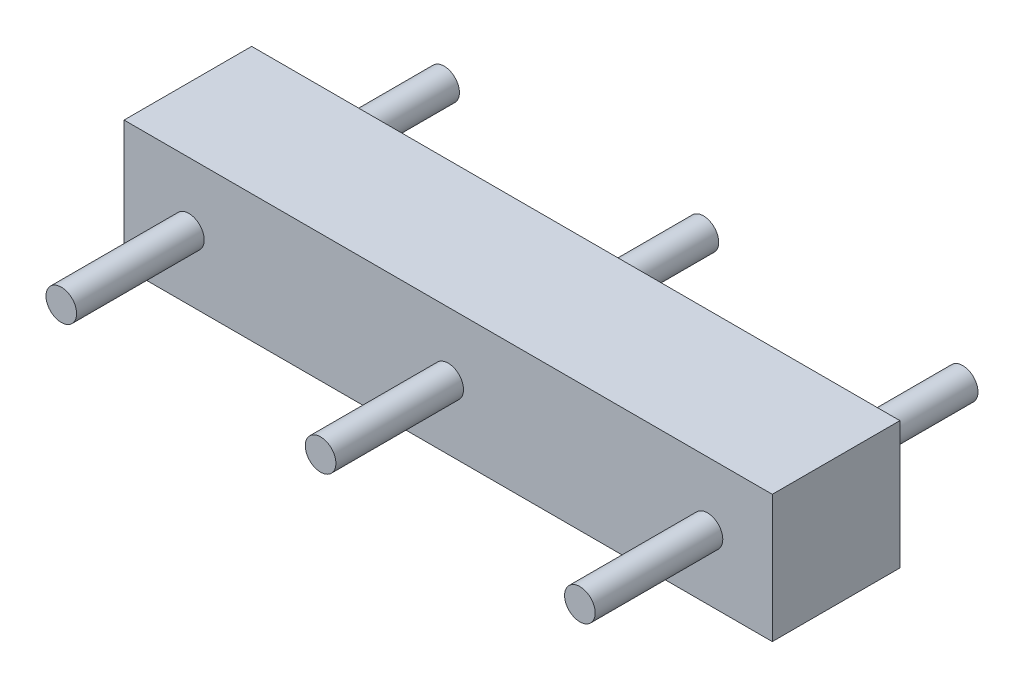
ISO-10303-21;
HEADER;
FILE_DESCRIPTION(('STEP AP214'),'2;1');
FILE_NAME('part.step','',(''),(''),'','','');
FILE_SCHEMA(('AUTOMOTIVE_DESIGN { 1 0 10303 214 1 1 1 1 }'));
ENDSEC;
DATA;
#1=APPLICATION_CONTEXT('core data for automotive mechanical design processes');
#2=APPLICATION_PROTOCOL_DEFINITION('international standard','automotive_design',2000,#1);
#3=PRODUCT_CONTEXT('',#1,'mechanical');
#4=PRODUCT('Part','Part','',(#3));
#5=PRODUCT_RELATED_PRODUCT_CATEGORY('part','',(#4));
#6=PRODUCT_DEFINITION_FORMATION('','',#4);
#7=PRODUCT_DEFINITION_CONTEXT('part definition',#1,'design');
#8=PRODUCT_DEFINITION('design','',#6,#7);
#9=PRODUCT_DEFINITION_SHAPE('','',#8);
#10=(LENGTH_UNIT() NAMED_UNIT(*) SI_UNIT(.MILLI.,.METRE.));
#11=(NAMED_UNIT(*) PLANE_ANGLE_UNIT() SI_UNIT($,.RADIAN.));
#12=(NAMED_UNIT(*) SI_UNIT($,.STERADIAN.) SOLID_ANGLE_UNIT());
#13=UNCERTAINTY_MEASURE_WITH_UNIT(LENGTH_MEASURE(1.E-05),#10,'distance_accuracy_value','');
#14=(GEOMETRIC_REPRESENTATION_CONTEXT(3) GLOBAL_UNCERTAINTY_ASSIGNED_CONTEXT((#13)) GLOBAL_UNIT_ASSIGNED_CONTEXT((#10,
#11,#12)) REPRESENTATION_CONTEXT('',''));
#15=CARTESIAN_POINT('',(0.,0.,0.));
#16=DIRECTION('',(0.,0.,1.));
#17=DIRECTION('',(1.,0.,0.));
#18=AXIS2_PLACEMENT_3D('',#15,#16,#17);
#19=CARTESIAN_POINT('',(0.,0.,2.5));
#20=DIRECTION('',(1.,0.,0.));
#21=DIRECTION('',(0.,0.,-1.));
#22=AXIS2_PLACEMENT_3D('',#19,#20,#21);
#23=PLANE('',#22);
#24=DIRECTION('',(0.,-1.,0.));
#25=VECTOR('',#24,1.);
#26=CARTESIAN_POINT('',(0.,0.,0.));
#27=LINE('',#26,#25);
#28=CARTESIAN_POINT('',(0.,2.5,0.));
#29=VERTEX_POINT('',#28);
#30=CARTESIAN_POINT('',(0.,0.,0.));
#31=VERTEX_POINT('',#30);
#32=EDGE_CURVE('E103',#29,#31,#27,.T.);
#33=ORIENTED_EDGE('',*,*,#32,.T.);
#34=DIRECTION('',(0.,0.,-1.));
#35=VECTOR('',#34,1.);
#36=CARTESIAN_POINT('',(0.,0.,2.5));
#37=LINE('',#36,#35);
#38=CARTESIAN_POINT('',(0.,0.,2.5));
#39=VERTEX_POINT('',#38);
#40=EDGE_CURVE('E94',#39,#31,#37,.T.);
#41=ORIENTED_EDGE('',*,*,#40,.F.);
#42=DIRECTION('',(0.,-1.,0.));
#43=VECTOR('',#42,1.);
#44=CARTESIAN_POINT('',(0.,0.,2.5));
#45=LINE('',#44,#43);
#46=CARTESIAN_POINT('',(0.,2.5,2.5));
#47=VERTEX_POINT('',#46);
#48=EDGE_CURVE('E88',#47,#39,#45,.T.);
#49=ORIENTED_EDGE('',*,*,#48,.F.);
#50=DIRECTION('',(0.,0.,-1.));
#51=VECTOR('',#50,1.);
#52=CARTESIAN_POINT('',(0.,2.5,2.5));
#53=LINE('',#52,#51);
#54=EDGE_CURVE('E99',#47,#29,#53,.T.);
#55=ORIENTED_EDGE('',*,*,#54,.T.);
#56=EDGE_LOOP('',(#33,#41,#49,#55));
#57=FACE_BOUND('',#56,.T.);
#58=ADVANCED_FACE('F36',(#57),#23,.F.);
#59=CARTESIAN_POINT('',(0.,0.,2.5));
#60=DIRECTION('',(0.,1.,0.));
#61=DIRECTION('',(0.,0.,1.));
#62=AXIS2_PLACEMENT_3D('',#59,#60,#61);
#63=PLANE('',#62);
#64=DIRECTION('',(1.,0.,0.));
#65=VECTOR('',#64,1.);
#66=CARTESIAN_POINT('',(0.,0.,0.));
#67=LINE('',#66,#65);
#68=CARTESIAN_POINT('',(12.7,0.,0.));
#69=VERTEX_POINT('',#68);
#70=EDGE_CURVE('E93',#31,#69,#67,.T.);
#71=ORIENTED_EDGE('',*,*,#70,.T.);
#72=DIRECTION('',(0.,0.,-1.));
#73=VECTOR('',#72,1.);
#74=CARTESIAN_POINT('',(12.7,0.,2.5));
#75=LINE('',#74,#73);
#76=CARTESIAN_POINT('',(12.7,0.,2.5));
#77=VERTEX_POINT('',#76);
#78=EDGE_CURVE('E91',#77,#69,#75,.T.);
#79=ORIENTED_EDGE('',*,*,#78,.F.);
#80=DIRECTION('',(1.,0.,0.));
#81=VECTOR('',#80,1.);
#82=CARTESIAN_POINT('',(0.,0.,2.5));
#83=LINE('',#82,#81);
#84=EDGE_CURVE('E83',#39,#77,#83,.T.);
#85=ORIENTED_EDGE('',*,*,#84,.F.);
#86=ORIENTED_EDGE('',*,*,#40,.T.);
#87=EDGE_LOOP('',(#71,#79,#85,#86));
#88=FACE_BOUND('',#87,.T.);
#89=ADVANCED_FACE('F92',(#88),#63,.F.);
#90=CARTESIAN_POINT('',(12.7,0.,2.5));
#91=DIRECTION('',(-1.,0.,0.));
#92=DIRECTION('',(0.,0.,1.));
#93=AXIS2_PLACEMENT_3D('',#90,#91,#92);
#94=PLANE('',#93);
#95=DIRECTION('',(0.,1.,0.));
#96=VECTOR('',#95,1.);
#97=CARTESIAN_POINT('',(12.7,0.,0.));
#98=LINE('',#97,#96);
#99=CARTESIAN_POINT('',(12.7,2.5,0.));
#100=VERTEX_POINT('',#99);
#101=EDGE_CURVE('E69',#69,#100,#98,.T.);
#102=ORIENTED_EDGE('',*,*,#101,.T.);
#103=DIRECTION('',(0.,0.,-1.));
#104=VECTOR('',#103,1.);
#105=CARTESIAN_POINT('',(12.7,2.5,2.5));
#106=LINE('',#105,#104);
#107=CARTESIAN_POINT('',(12.7,2.5,2.5));
#108=VERTEX_POINT('',#107);
#109=EDGE_CURVE('E95',#108,#100,#106,.T.);
#110=ORIENTED_EDGE('',*,*,#109,.F.);
#111=DIRECTION('',(0.,1.,0.));
#112=VECTOR('',#111,1.);
#113=CARTESIAN_POINT('',(12.7,0.,2.5));
#114=LINE('',#113,#112);
#115=EDGE_CURVE('E86',#77,#108,#114,.T.);
#116=ORIENTED_EDGE('',*,*,#115,.F.);
#117=ORIENTED_EDGE('',*,*,#78,.T.);
#118=EDGE_LOOP('',(#102,#110,#116,#117));
#119=FACE_BOUND('',#118,.T.);
#120=ADVANCED_FACE('F97',(#119),#94,.F.);
#121=CARTESIAN_POINT('',(0.,2.5,2.5));
#122=DIRECTION('',(0.,-1.,0.));
#123=DIRECTION('',(0.,0.,-1.));
#124=AXIS2_PLACEMENT_3D('',#121,#122,#123);
#125=PLANE('',#124);
#126=DIRECTION('',(-1.,0.,0.));
#127=VECTOR('',#126,1.);
#128=CARTESIAN_POINT('',(0.,2.5,0.));
#129=LINE('',#128,#127);
#130=EDGE_CURVE('E75',#100,#29,#129,.T.);
#131=ORIENTED_EDGE('',*,*,#130,.T.);
#132=ORIENTED_EDGE('',*,*,#54,.F.);
#133=DIRECTION('',(-1.,0.,0.));
#134=VECTOR('',#133,1.);
#135=CARTESIAN_POINT('',(0.,2.5,2.5));
#136=LINE('',#135,#134);
#137=EDGE_CURVE('E52',#108,#47,#136,.T.);
#138=ORIENTED_EDGE('',*,*,#137,.F.);
#139=ORIENTED_EDGE('',*,*,#109,.T.);
#140=EDGE_LOOP('',(#131,#132,#138,#139));
#141=FACE_BOUND('',#140,.T.);
#142=ADVANCED_FACE('F131',(#141),#125,.F.);
#143=CARTESIAN_POINT('',(0.,0.,2.5));
#144=DIRECTION('',(0.,0.,-1.));
#145=DIRECTION('',(-1.,0.,0.));
#146=AXIS2_PLACEMENT_3D('',#143,#144,#145);
#147=PLANE('',#146);
#148=CARTESIAN_POINT('',(11.43,1.25,2.5));
#149=DIRECTION('',(0.,0.,-1.));
#150=DIRECTION('',(-1.,0.,0.));
#151=AXIS2_PLACEMENT_3D('',#148,#149,#150);
#152=CIRCLE('',#151,0.3);
#153=CARTESIAN_POINT('',(11.13,1.25,2.5));
#154=VERTEX_POINT('',#153);
#155=EDGE_CURVE('E291',#154,#154,#152,.T.);
#156=ORIENTED_EDGE('',*,*,#155,.T.);
#157=EDGE_LOOP('',(#156));
#158=FACE_BOUND('',#157,.T.);
#159=CARTESIAN_POINT('',(1.27,1.25,2.5));
#160=DIRECTION('',(0.,0.,-1.));
#161=DIRECTION('',(-1.,0.,0.));
#162=AXIS2_PLACEMENT_3D('',#159,#160,#161);
#163=CIRCLE('',#162,0.3);
#164=CARTESIAN_POINT('',(0.969999999999999,1.25,2.5));
#165=VERTEX_POINT('',#164);
#166=EDGE_CURVE('E302',#165,#165,#163,.T.);
#167=ORIENTED_EDGE('',*,*,#166,.T.);
#168=EDGE_LOOP('',(#167));
#169=FACE_BOUND('',#168,.T.);
#170=CARTESIAN_POINT('',(6.35,1.25,2.5));
#171=DIRECTION('',(0.,0.,-1.));
#172=DIRECTION('',(-1.,0.,0.));
#173=AXIS2_PLACEMENT_3D('',#170,#171,#172);
#174=CIRCLE('',#173,0.3);
#175=CARTESIAN_POINT('',(6.05,1.25,2.5));
#176=VERTEX_POINT('',#175);
#177=EDGE_CURVE('E106',#176,#176,#174,.T.);
#178=ORIENTED_EDGE('',*,*,#177,.T.);
#179=EDGE_LOOP('',(#178));
#180=FACE_BOUND('',#179,.T.);
#181=ORIENTED_EDGE('',*,*,#48,.T.);
#182=ORIENTED_EDGE('',*,*,#84,.T.);
#183=ORIENTED_EDGE('',*,*,#115,.T.);
#184=ORIENTED_EDGE('',*,*,#137,.T.);
#185=EDGE_LOOP('',(#181,#182,#183,#184));
#186=FACE_BOUND('',#185,.T.);
#187=ADVANCED_FACE('F84',(#158,#169,#180,#186),#147,.F.);
#188=CARTESIAN_POINT('',(0.,0.,0.));
#189=DIRECTION('',(0.,0.,-1.));
#190=DIRECTION('',(-1.,0.,0.));
#191=AXIS2_PLACEMENT_3D('',#188,#189,#190);
#192=PLANE('',#191);
#193=CARTESIAN_POINT('',(11.43,1.25,0.));
#194=DIRECTION('',(0.,0.,-1.));
#195=DIRECTION('',(-1.,0.,0.));
#196=AXIS2_PLACEMENT_3D('',#193,#194,#195);
#197=CIRCLE('',#196,0.3);
#198=CARTESIAN_POINT('',(11.13,1.25,0.));
#199=VERTEX_POINT('',#198);
#200=EDGE_CURVE('E11',#199,#199,#197,.T.);
#201=ORIENTED_EDGE('',*,*,#200,.F.);
#202=EDGE_LOOP('',(#201));
#203=FACE_BOUND('',#202,.T.);
#204=CARTESIAN_POINT('',(1.27,1.25,0.));
#205=DIRECTION('',(0.,0.,-1.));
#206=DIRECTION('',(-1.,0.,0.));
#207=AXIS2_PLACEMENT_3D('',#204,#205,#206);
#208=CIRCLE('',#207,0.3);
#209=CARTESIAN_POINT('',(0.969999999999999,1.25,0.));
#210=VERTEX_POINT('',#209);
#211=EDGE_CURVE('E44',#210,#210,#208,.T.);
#212=ORIENTED_EDGE('',*,*,#211,.F.);
#213=EDGE_LOOP('',(#212));
#214=FACE_BOUND('',#213,.T.);
#215=CARTESIAN_POINT('',(6.35,1.25,0.));
#216=DIRECTION('',(0.,0.,-1.));
#217=DIRECTION('',(-1.,0.,0.));
#218=AXIS2_PLACEMENT_3D('',#215,#216,#217);
#219=CIRCLE('',#218,0.3);
#220=CARTESIAN_POINT('',(6.05,1.25,0.));
#221=VERTEX_POINT('',#220);
#222=EDGE_CURVE('E113',#221,#221,#219,.T.);
#223=ORIENTED_EDGE('',*,*,#222,.F.);
#224=EDGE_LOOP('',(#223));
#225=FACE_BOUND('',#224,.T.);
#226=ORIENTED_EDGE('',*,*,#32,.F.);
#227=ORIENTED_EDGE('',*,*,#130,.F.);
#228=ORIENTED_EDGE('',*,*,#101,.F.);
#229=ORIENTED_EDGE('',*,*,#70,.F.);
#230=EDGE_LOOP('',(#226,#227,#228,#229));
#231=FACE_BOUND('',#230,.T.);
#232=ADVANCED_FACE('F121',(#203,#214,#225,#231),#192,.T.);
#233=CARTESIAN_POINT('',(6.35,1.25,-2.5));
#234=DIRECTION('',(0.,0.,1.));
#235=DIRECTION('',(1.,0.,0.));
#236=AXIS2_PLACEMENT_3D('',#233,#234,#235);
#237=PLANE('',#236);
#238=CARTESIAN_POINT('',(6.35,1.25,-2.5));
#239=DIRECTION('',(0.,0.,1.));
#240=DIRECTION('',(1.,0.,0.));
#241=AXIS2_PLACEMENT_3D('',#238,#239,#240);
#242=CIRCLE('',#241,0.3);
#243=CARTESIAN_POINT('',(6.65,1.25,-2.5));
#244=VERTEX_POINT('',#243);
#245=EDGE_CURVE('E308',#244,#244,#242,.T.);
#246=ORIENTED_EDGE('',*,*,#245,.F.);
#247=EDGE_LOOP('',(#246));
#248=FACE_BOUND('',#247,.T.);
#249=ADVANCED_FACE('F124',(#248),#237,.F.);
#250=CARTESIAN_POINT('',(6.35,1.25,-2.5));
#251=DIRECTION('',(0.,0.,1.));
#252=DIRECTION('',(1.,0.,0.));
#253=AXIS2_PLACEMENT_3D('',#250,#251,#252);
#254=CYLINDRICAL_SURFACE('',#253,0.3);
#255=ORIENTED_EDGE('',*,*,#222,.T.);
#256=EDGE_LOOP('',(#255));
#257=FACE_BOUND('',#256,.T.);
#258=ORIENTED_EDGE('',*,*,#245,.T.);
#259=EDGE_LOOP('',(#258));
#260=FACE_BOUND('',#259,.T.);
#261=ADVANCED_FACE('F165',(#257,#260),#254,.T.);
#262=CARTESIAN_POINT('',(6.35,1.25,5.));
#263=DIRECTION('',(0.,0.,1.));
#264=DIRECTION('',(1.,0.,0.));
#265=AXIS2_PLACEMENT_3D('',#262,#263,#264);
#266=CIRCLE('',#265,0.3);
#267=CARTESIAN_POINT('',(6.65,1.25,5.));
#268=VERTEX_POINT('',#267);
#269=EDGE_CURVE('E305',#268,#268,#266,.T.);
#270=ORIENTED_EDGE('',*,*,#269,.F.);
#271=EDGE_LOOP('',(#270));
#272=FACE_BOUND('',#271,.T.);
#273=ORIENTED_EDGE('',*,*,#177,.F.);
#274=EDGE_LOOP('',(#273));
#275=FACE_BOUND('',#274,.T.);
#276=ADVANCED_FACE('F176',(#272,#275),#254,.T.);
#277=CARTESIAN_POINT('',(6.35,1.25,5.));
#278=DIRECTION('',(0.,0.,1.));
#279=DIRECTION('',(1.,0.,0.));
#280=AXIS2_PLACEMENT_3D('',#277,#278,#279);
#281=PLANE('',#280);
#282=ORIENTED_EDGE('',*,*,#269,.T.);
#283=EDGE_LOOP('',(#282));
#284=FACE_BOUND('',#283,.T.);
#285=ADVANCED_FACE('F186',(#284),#281,.T.);
#286=CARTESIAN_POINT('',(1.27,1.25,-2.5));
#287=DIRECTION('',(0.,0.,1.));
#288=DIRECTION('',(1.,0.,0.));
#289=AXIS2_PLACEMENT_3D('',#286,#287,#288);
#290=PLANE('',#289);
#291=CARTESIAN_POINT('',(1.27,1.25,-2.5));
#292=DIRECTION('',(0.,0.,1.));
#293=DIRECTION('',(1.,0.,0.));
#294=AXIS2_PLACEMENT_3D('',#291,#292,#293);
#295=CIRCLE('',#294,0.3);
#296=CARTESIAN_POINT('',(1.57,1.25,-2.5));
#297=VERTEX_POINT('',#296);
#298=EDGE_CURVE('E299',#297,#297,#295,.T.);
#299=ORIENTED_EDGE('',*,*,#298,.F.);
#300=EDGE_LOOP('',(#299));
#301=FACE_BOUND('',#300,.T.);
#302=ADVANCED_FACE('F195',(#301),#290,.F.);
#303=CARTESIAN_POINT('',(1.27,1.25,-2.5));
#304=DIRECTION('',(0.,0.,1.));
#305=DIRECTION('',(1.,0.,0.));
#306=AXIS2_PLACEMENT_3D('',#303,#304,#305);
#307=CYLINDRICAL_SURFACE('',#306,0.3);
#308=ORIENTED_EDGE('',*,*,#211,.T.);
#309=EDGE_LOOP('',(#308));
#310=FACE_BOUND('',#309,.T.);
#311=ORIENTED_EDGE('',*,*,#298,.T.);
#312=EDGE_LOOP('',(#311));
#313=FACE_BOUND('',#312,.T.);
#314=ADVANCED_FACE('F118',(#310,#313),#307,.T.);
#315=CARTESIAN_POINT('',(1.27,1.25,5.));
#316=DIRECTION('',(0.,0.,1.));
#317=DIRECTION('',(1.,0.,0.));
#318=AXIS2_PLACEMENT_3D('',#315,#316,#317);
#319=CIRCLE('',#318,0.3);
#320=CARTESIAN_POINT('',(1.57,1.25,5.));
#321=VERTEX_POINT('',#320);
#322=EDGE_CURVE('E296',#321,#321,#319,.T.);
#323=ORIENTED_EDGE('',*,*,#322,.F.);
#324=EDGE_LOOP('',(#323));
#325=FACE_BOUND('',#324,.T.);
#326=ORIENTED_EDGE('',*,*,#166,.F.);
#327=EDGE_LOOP('',(#326));
#328=FACE_BOUND('',#327,.T.);
#329=ADVANCED_FACE('F224',(#325,#328),#307,.T.);
#330=CARTESIAN_POINT('',(1.27,1.25,5.));
#331=DIRECTION('',(0.,0.,1.));
#332=DIRECTION('',(1.,0.,0.));
#333=AXIS2_PLACEMENT_3D('',#330,#331,#332);
#334=PLANE('',#333);
#335=ORIENTED_EDGE('',*,*,#322,.T.);
#336=EDGE_LOOP('',(#335));
#337=FACE_BOUND('',#336,.T.);
#338=ADVANCED_FACE('F233',(#337),#334,.T.);
#339=CARTESIAN_POINT('',(11.43,1.25,-2.5));
#340=DIRECTION('',(0.,0.,1.));
#341=DIRECTION('',(1.,0.,0.));
#342=AXIS2_PLACEMENT_3D('',#339,#340,#341);
#343=PLANE('',#342);
#344=CARTESIAN_POINT('',(11.43,1.25,-2.5));
#345=DIRECTION('',(0.,0.,1.));
#346=DIRECTION('',(1.,0.,0.));
#347=AXIS2_PLACEMENT_3D('',#344,#345,#346);
#348=CIRCLE('',#347,0.3);
#349=CARTESIAN_POINT('',(11.73,1.25,-2.5));
#350=VERTEX_POINT('',#349);
#351=EDGE_CURVE('E288',#350,#350,#348,.T.);
#352=ORIENTED_EDGE('',*,*,#351,.F.);
#353=EDGE_LOOP('',(#352));
#354=FACE_BOUND('',#353,.T.);
#355=ADVANCED_FACE('F242',(#354),#343,.F.);
#356=CARTESIAN_POINT('',(11.43,1.25,-2.5));
#357=DIRECTION('',(0.,0.,1.));
#358=DIRECTION('',(1.,0.,0.));
#359=AXIS2_PLACEMENT_3D('',#356,#357,#358);
#360=CYLINDRICAL_SURFACE('',#359,0.3);
#361=ORIENTED_EDGE('',*,*,#200,.T.);
#362=EDGE_LOOP('',(#361));
#363=FACE_BOUND('',#362,.T.);
#364=ORIENTED_EDGE('',*,*,#351,.T.);
#365=EDGE_LOOP('',(#364));
#366=FACE_BOUND('',#365,.T.);
#367=ADVANCED_FACE('F252',(#363,#366),#360,.T.);
#368=CARTESIAN_POINT('',(11.43,1.25,5.));
#369=DIRECTION('',(0.,0.,1.));
#370=DIRECTION('',(1.,0.,0.));
#371=AXIS2_PLACEMENT_3D('',#368,#369,#370);
#372=CIRCLE('',#371,0.3);
#373=CARTESIAN_POINT('',(11.73,1.25,5.));
#374=VERTEX_POINT('',#373);
#375=EDGE_CURVE('E287',#374,#374,#372,.T.);
#376=ORIENTED_EDGE('',*,*,#375,.F.);
#377=EDGE_LOOP('',(#376));
#378=FACE_BOUND('',#377,.T.);
#379=ORIENTED_EDGE('',*,*,#155,.F.);
#380=EDGE_LOOP('',(#379));
#381=FACE_BOUND('',#380,.T.);
#382=ADVANCED_FACE('F262',(#378,#381),#360,.T.);
#383=CARTESIAN_POINT('',(11.43,1.25,5.));
#384=DIRECTION('',(0.,0.,1.));
#385=DIRECTION('',(1.,0.,0.));
#386=AXIS2_PLACEMENT_3D('',#383,#384,#385);
#387=PLANE('',#386);
#388=ORIENTED_EDGE('',*,*,#375,.T.);
#389=EDGE_LOOP('',(#388));
#390=FACE_BOUND('',#389,.T.);
#391=ADVANCED_FACE('F272',(#390),#387,.T.);
#392=CLOSED_SHELL('',(#58,#89,#120,#142,#187,#232,#249,#261,#276,#285,#302,#314,#329,#338,#355,
#367,#382,#391));
#393=MANIFOLD_SOLID_BREP('B2',#392);
#394=ADVANCED_BREP_SHAPE_REPRESENTATION('',(#18,#393),#14);
#395=SHAPE_DEFINITION_REPRESENTATION(#9,#394);
ENDSEC;
END-ISO-10303-21;
